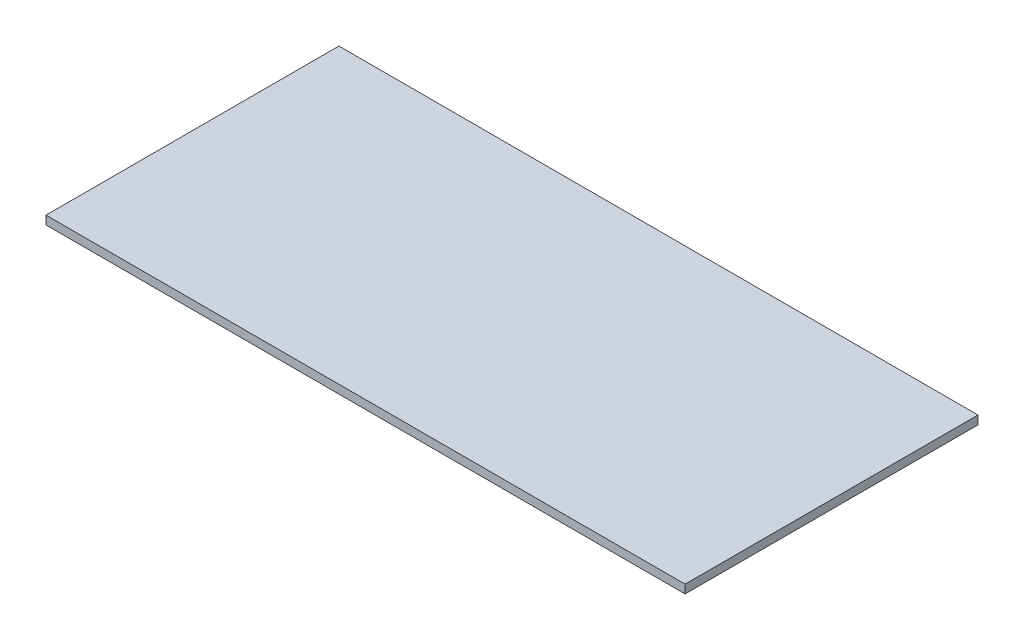
ISO-10303-21;
HEADER;
FILE_DESCRIPTION(('STEP AP214'),'2;1');
FILE_NAME('part.step','',(''),(''),'','','');
FILE_SCHEMA(('AUTOMOTIVE_DESIGN { 1 0 10303 214 1 1 1 1 }'));
ENDSEC;
DATA;
#1=APPLICATION_CONTEXT('core data for automotive mechanical design processes');
#2=APPLICATION_PROTOCOL_DEFINITION('international standard','automotive_design',2000,#1);
#3=PRODUCT_CONTEXT('',#1,'mechanical');
#4=PRODUCT('Part','Part','',(#3));
#5=PRODUCT_RELATED_PRODUCT_CATEGORY('part','',(#4));
#6=PRODUCT_DEFINITION_FORMATION('','',#4);
#7=PRODUCT_DEFINITION_CONTEXT('part definition',#1,'design');
#8=PRODUCT_DEFINITION('design','',#6,#7);
#9=PRODUCT_DEFINITION_SHAPE('','',#8);
#10=(LENGTH_UNIT() NAMED_UNIT(*) SI_UNIT(.MILLI.,.METRE.));
#11=(NAMED_UNIT(*) PLANE_ANGLE_UNIT() SI_UNIT($,.RADIAN.));
#12=(NAMED_UNIT(*) SI_UNIT($,.STERADIAN.) SOLID_ANGLE_UNIT());
#13=UNCERTAINTY_MEASURE_WITH_UNIT(LENGTH_MEASURE(1.E-05),#10,'distance_accuracy_value','');
#14=(GEOMETRIC_REPRESENTATION_CONTEXT(3) GLOBAL_UNCERTAINTY_ASSIGNED_CONTEXT((#13)) GLOBAL_UNIT_ASSIGNED_CONTEXT((#10,
#11,#12)) REPRESENTATION_CONTEXT('',''));
#15=CARTESIAN_POINT('',(0.,0.,0.));
#16=DIRECTION('',(0.,0.,1.));
#17=DIRECTION('',(1.,0.,0.));
#18=AXIS2_PLACEMENT_3D('',#15,#16,#17);
#19=CARTESIAN_POINT('',(-60.,1.6,27.5));
#20=DIRECTION('',(1.,0.,0.));
#21=DIRECTION('',(0.,0.,-1.));
#22=AXIS2_PLACEMENT_3D('',#19,#20,#21);
#23=PLANE('',#22);
#24=DIRECTION('',(0.,0.,1.));
#25=VECTOR('',#24,1.);
#26=CARTESIAN_POINT('',(-60.,0.,27.5));
#27=LINE('',#26,#25);
#28=CARTESIAN_POINT('',(-60.,0.,-27.5));
#29=VERTEX_POINT('',#28);
#30=CARTESIAN_POINT('',(-60.,0.,27.5));
#31=VERTEX_POINT('',#30);
#32=EDGE_CURVE('E105',#29,#31,#27,.T.);
#33=ORIENTED_EDGE('',*,*,#32,.T.);
#34=DIRECTION('',(0.,-1.,0.));
#35=VECTOR('',#34,1.);
#36=CARTESIAN_POINT('',(-60.,1.6,27.5));
#37=LINE('',#36,#35);
#38=CARTESIAN_POINT('',(-60.,1.6,27.5));
#39=VERTEX_POINT('',#38);
#40=EDGE_CURVE('E11',#39,#31,#37,.T.);
#41=ORIENTED_EDGE('',*,*,#40,.F.);
#42=DIRECTION('',(0.,0.,1.));
#43=VECTOR('',#42,1.);
#44=CARTESIAN_POINT('',(-60.,1.6,27.5));
#45=LINE('',#44,#43);
#46=CARTESIAN_POINT('',(-60.,1.6,-27.5));
#47=VERTEX_POINT('',#46);
#48=EDGE_CURVE('E89',#47,#39,#45,.T.);
#49=ORIENTED_EDGE('',*,*,#48,.F.);
#50=DIRECTION('',(0.,-1.,0.));
#51=VECTOR('',#50,1.);
#52=CARTESIAN_POINT('',(-60.,1.6,-27.5));
#53=LINE('',#52,#51);
#54=EDGE_CURVE('E97',#47,#29,#53,.T.);
#55=ORIENTED_EDGE('',*,*,#54,.T.);
#56=EDGE_LOOP('',(#33,#41,#49,#55));
#57=FACE_BOUND('',#56,.T.);
#58=ADVANCED_FACE('F39',(#57),#23,.F.);
#59=CARTESIAN_POINT('',(-60.,1.6,27.5));
#60=DIRECTION('',(0.,0.,-1.));
#61=DIRECTION('',(-1.,0.,0.));
#62=AXIS2_PLACEMENT_3D('',#59,#60,#61);
#63=PLANE('',#62);
#64=DIRECTION('',(1.,0.,0.));
#65=VECTOR('',#64,1.);
#66=CARTESIAN_POINT('',(-60.,0.,27.5));
#67=LINE('',#66,#65);
#68=CARTESIAN_POINT('',(60.,0.,27.5));
#69=VERTEX_POINT('',#68);
#70=EDGE_CURVE('E92',#31,#69,#67,.T.);
#71=ORIENTED_EDGE('',*,*,#70,.T.);
#72=DIRECTION('',(0.,-1.,0.));
#73=VECTOR('',#72,1.);
#74=CARTESIAN_POINT('',(60.,1.6,27.5));
#75=LINE('',#74,#73);
#76=CARTESIAN_POINT('',(60.,1.6,27.5));
#77=VERTEX_POINT('',#76);
#78=EDGE_CURVE('E50',#77,#69,#75,.T.);
#79=ORIENTED_EDGE('',*,*,#78,.F.);
#80=DIRECTION('',(1.,0.,0.));
#81=VECTOR('',#80,1.);
#82=CARTESIAN_POINT('',(-60.,1.6,27.5));
#83=LINE('',#82,#81);
#84=EDGE_CURVE('E82',#39,#77,#83,.T.);
#85=ORIENTED_EDGE('',*,*,#84,.F.);
#86=ORIENTED_EDGE('',*,*,#40,.T.);
#87=EDGE_LOOP('',(#71,#79,#85,#86));
#88=FACE_BOUND('',#87,.T.);
#89=ADVANCED_FACE('F93',(#88),#63,.F.);
#90=CARTESIAN_POINT('',(60.,1.6,27.5));
#91=DIRECTION('',(-1.,0.,0.));
#92=DIRECTION('',(0.,0.,1.));
#93=AXIS2_PLACEMENT_3D('',#90,#91,#92);
#94=PLANE('',#93);
#95=DIRECTION('',(0.,0.,-1.));
#96=VECTOR('',#95,1.);
#97=CARTESIAN_POINT('',(60.,0.,27.5));
#98=LINE('',#97,#96);
#99=CARTESIAN_POINT('',(60.,0.,-27.5));
#100=VERTEX_POINT('',#99);
#101=EDGE_CURVE('E72',#69,#100,#98,.T.);
#102=ORIENTED_EDGE('',*,*,#101,.T.);
#103=DIRECTION('',(0.,-1.,0.));
#104=VECTOR('',#103,1.);
#105=CARTESIAN_POINT('',(60.,1.6,-27.5));
#106=LINE('',#105,#104);
#107=CARTESIAN_POINT('',(60.,1.6,-27.5));
#108=VERTEX_POINT('',#107);
#109=EDGE_CURVE('E94',#108,#100,#106,.T.);
#110=ORIENTED_EDGE('',*,*,#109,.F.);
#111=DIRECTION('',(0.,0.,-1.));
#112=VECTOR('',#111,1.);
#113=CARTESIAN_POINT('',(60.,1.6,27.5));
#114=LINE('',#113,#112);
#115=EDGE_CURVE('E88',#77,#108,#114,.T.);
#116=ORIENTED_EDGE('',*,*,#115,.F.);
#117=ORIENTED_EDGE('',*,*,#78,.T.);
#118=EDGE_LOOP('',(#102,#110,#116,#117));
#119=FACE_BOUND('',#118,.T.);
#120=ADVANCED_FACE('F96',(#119),#94,.F.);
#121=CARTESIAN_POINT('',(-60.,1.6,-27.5));
#122=DIRECTION('',(0.,0.,1.));
#123=DIRECTION('',(1.,0.,0.));
#124=AXIS2_PLACEMENT_3D('',#121,#122,#123);
#125=PLANE('',#124);
#126=DIRECTION('',(-1.,0.,0.));
#127=VECTOR('',#126,1.);
#128=CARTESIAN_POINT('',(-60.,0.,-27.5));
#129=LINE('',#128,#127);
#130=EDGE_CURVE('E76',#100,#29,#129,.T.);
#131=ORIENTED_EDGE('',*,*,#130,.T.);
#132=ORIENTED_EDGE('',*,*,#54,.F.);
#133=DIRECTION('',(-1.,0.,0.));
#134=VECTOR('',#133,1.);
#135=CARTESIAN_POINT('',(-60.,1.6,-27.5));
#136=LINE('',#135,#134);
#137=EDGE_CURVE('E54',#108,#47,#136,.T.);
#138=ORIENTED_EDGE('',*,*,#137,.F.);
#139=ORIENTED_EDGE('',*,*,#109,.T.);
#140=EDGE_LOOP('',(#131,#132,#138,#139));
#141=FACE_BOUND('',#140,.T.);
#142=ADVANCED_FACE('F108',(#141),#125,.F.);
#143=CARTESIAN_POINT('',(0.,1.6,0.));
#144=DIRECTION('',(0.,-1.,0.));
#145=DIRECTION('',(0.,0.,-1.));
#146=AXIS2_PLACEMENT_3D('',#143,#144,#145);
#147=PLANE('',#146);
#148=ORIENTED_EDGE('',*,*,#48,.T.);
#149=ORIENTED_EDGE('',*,*,#84,.T.);
#150=ORIENTED_EDGE('',*,*,#115,.T.);
#151=ORIENTED_EDGE('',*,*,#137,.T.);
#152=EDGE_LOOP('',(#148,#149,#150,#151));
#153=FACE_BOUND('',#152,.T.);
#154=ADVANCED_FACE('F86',(#153),#147,.F.);
#155=CARTESIAN_POINT('',(0.,0.,0.));
#156=DIRECTION('',(0.,-1.,0.));
#157=DIRECTION('',(0.,0.,-1.));
#158=AXIS2_PLACEMENT_3D('',#155,#156,#157);
#159=PLANE('',#158);
#160=ORIENTED_EDGE('',*,*,#32,.F.);
#161=ORIENTED_EDGE('',*,*,#130,.F.);
#162=ORIENTED_EDGE('',*,*,#101,.F.);
#163=ORIENTED_EDGE('',*,*,#70,.F.);
#164=EDGE_LOOP('',(#160,#161,#162,#163));
#165=FACE_BOUND('',#164,.T.);
#166=ADVANCED_FACE('F115',(#165),#159,.T.);
#167=CLOSED_SHELL('',(#58,#89,#120,#142,#154,#166));
#168=MANIFOLD_SOLID_BREP('B2',#167);
#169=ADVANCED_BREP_SHAPE_REPRESENTATION('',(#18,#168),#14);
#170=SHAPE_DEFINITION_REPRESENTATION(#9,#169);
ENDSEC;
END-ISO-10303-21;
